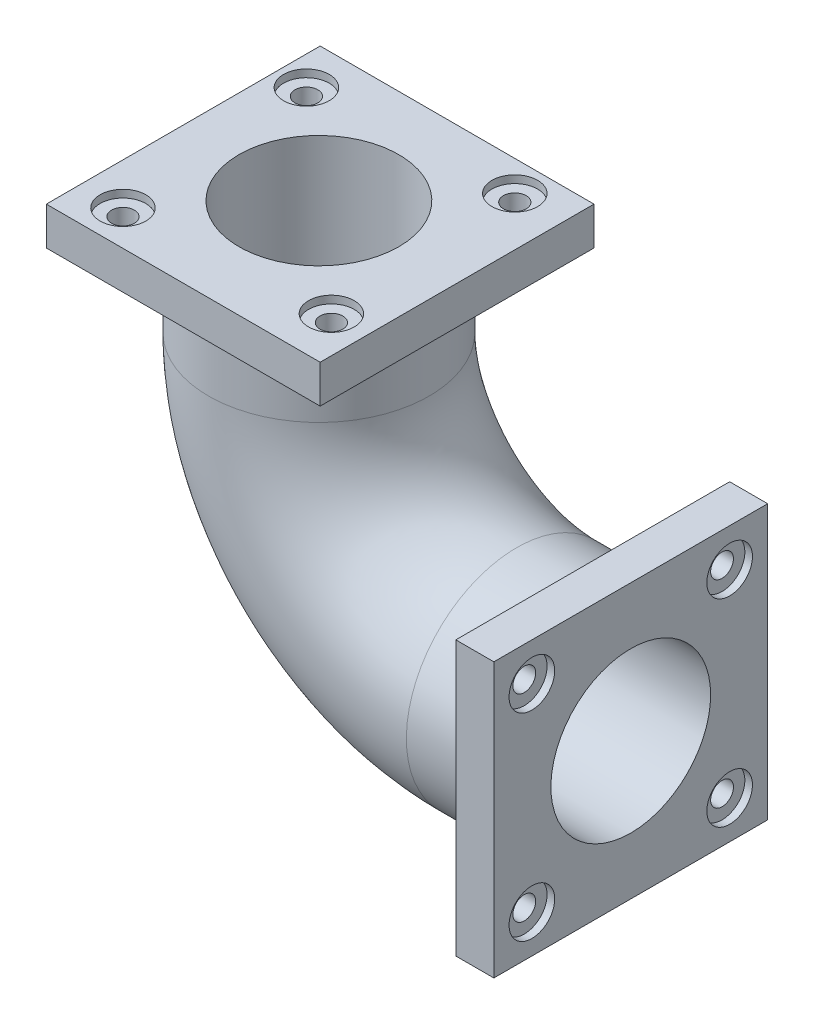
ISO-10303-21;
HEADER;
FILE_DESCRIPTION(('STEP AP214'),'2;1');
FILE_NAME('part.step','',(''),(''),'','','');
FILE_SCHEMA(('AUTOMOTIVE_DESIGN { 1 0 10303 214 1 1 1 1 }'));
ENDSEC;
DATA;
#1=APPLICATION_CONTEXT('core data for automotive mechanical design processes');
#2=APPLICATION_PROTOCOL_DEFINITION('international standard','automotive_design',2000,#1);
#3=PRODUCT_CONTEXT('',#1,'mechanical');
#4=PRODUCT('Part','Part','',(#3));
#5=PRODUCT_RELATED_PRODUCT_CATEGORY('part','',(#4));
#6=PRODUCT_DEFINITION_FORMATION('','',#4);
#7=PRODUCT_DEFINITION_CONTEXT('part definition',#1,'design');
#8=PRODUCT_DEFINITION('design','',#6,#7);
#9=PRODUCT_DEFINITION_SHAPE('','',#8);
#10=(LENGTH_UNIT() NAMED_UNIT(*) SI_UNIT(.MILLI.,.METRE.));
#11=(NAMED_UNIT(*) PLANE_ANGLE_UNIT() SI_UNIT($,.RADIAN.));
#12=(NAMED_UNIT(*) SI_UNIT($,.STERADIAN.) SOLID_ANGLE_UNIT());
#13=UNCERTAINTY_MEASURE_WITH_UNIT(LENGTH_MEASURE(1.E-05),#10,'distance_accuracy_value','');
#14=(GEOMETRIC_REPRESENTATION_CONTEXT(3) GLOBAL_UNCERTAINTY_ASSIGNED_CONTEXT((#13)) GLOBAL_UNIT_ASSIGNED_CONTEXT((#10,
#11,#12)) REPRESENTATION_CONTEXT('',''));
#15=CARTESIAN_POINT('',(0.,0.,0.));
#16=DIRECTION('',(0.,0.,1.));
#17=DIRECTION('',(1.,0.,0.));
#18=AXIS2_PLACEMENT_3D('',#15,#16,#17);
#19=CARTESIAN_POINT('',(-410.,260.,0.));
#20=DIRECTION('',(0.,1.,0.));
#21=DIRECTION('',(-1.,0.,0.));
#22=AXIS2_PLACEMENT_3D('',#19,#20,#21);
#23=CYLINDRICAL_SURFACE('',#22,145.);
#24=CARTESIAN_POINT('',(-410.,260.,0.));
#25=DIRECTION('',(0.,-1.,0.));
#26=DIRECTION('',(0.,0.,-1.));
#27=AXIS2_PLACEMENT_3D('',#24,#25,#26);
#28=CIRCLE('',#27,145.);
#29=CARTESIAN_POINT('',(-555.,260.,0.));
#30=VERTEX_POINT('',#29);
#31=EDGE_CURVE('E197',#30,#30,#28,.T.);
#32=ORIENTED_EDGE('',*,*,#31,.F.);
#33=EDGE_LOOP('',(#32));
#34=FACE_BOUND('',#33,.T.);
#35=CARTESIAN_POINT('',(-410.,360.,0.));
#36=DIRECTION('',(0.,1.,0.));
#37=DIRECTION('',(-1.,0.,0.));
#38=AXIS2_PLACEMENT_3D('',#35,#36,#37);
#39=CIRCLE('',#38,145.);
#40=CARTESIAN_POINT('',(-555.,360.,0.));
#41=VERTEX_POINT('',#40);
#42=EDGE_CURVE('E11',#41,#41,#39,.T.);
#43=ORIENTED_EDGE('',*,*,#42,.F.);
#44=EDGE_LOOP('',(#43));
#45=FACE_BOUND('',#44,.T.);
#46=ADVANCED_FACE('F35',(#34,#45),#23,.T.);
#47=CARTESIAN_POINT('',(0.,0.,0.));
#48=DIRECTION('',(-1.,0.,0.));
#49=DIRECTION('',(0.,0.,1.));
#50=AXIS2_PLACEMENT_3D('',#47,#48,#49);
#51=CYLINDRICAL_SURFACE('',#50,145.);
#52=CARTESIAN_POINT('',(-150.,0.,0.));
#53=DIRECTION('',(1.,0.,0.));
#54=DIRECTION('',(0.,0.,-1.));
#55=AXIS2_PLACEMENT_3D('',#52,#53,#54);
#56=CIRCLE('',#55,145.);
#57=CARTESIAN_POINT('',(-150.,-145.,0.));
#58=VERTEX_POINT('',#57);
#59=EDGE_CURVE('E194',#58,#58,#56,.T.);
#60=ORIENTED_EDGE('',*,*,#59,.T.);
#61=EDGE_LOOP('',(#60));
#62=FACE_BOUND('',#61,.T.);
#63=CARTESIAN_POINT('',(-50.,0.,0.));
#64=DIRECTION('',(1.,0.,0.));
#65=DIRECTION('',(0.,0.,-1.));
#66=AXIS2_PLACEMENT_3D('',#63,#64,#65);
#67=CIRCLE('',#66,145.);
#68=CARTESIAN_POINT('',(-50.,0.,-145.));
#69=VERTEX_POINT('',#68);
#70=EDGE_CURVE('E45',#69,#69,#67,.T.);
#71=ORIENTED_EDGE('',*,*,#70,.F.);
#72=EDGE_LOOP('',(#71));
#73=FACE_BOUND('',#72,.T.);
#74=ADVANCED_FACE('F307',(#62,#73),#51,.T.);
#75=CARTESIAN_POINT('',(0.,0.,0.));
#76=DIRECTION('',(1.,0.,0.));
#77=DIRECTION('',(0.,0.,-1.));
#78=AXIS2_PLACEMENT_3D('',#75,#76,#77);
#79=PLANE('',#78);
#80=CARTESIAN_POINT('',(0.,-130.,130.));
#81=DIRECTION('',(1.,0.,0.));
#82=DIRECTION('',(0.,1.,0.));
#83=AXIS2_PLACEMENT_3D('',#80,#81,#82);
#84=CIRCLE('',#83,30.);
#85=CARTESIAN_POINT('',(0.,-100.,130.));
#86=VERTEX_POINT('',#85);
#87=EDGE_CURVE('E658',#86,#86,#84,.T.);
#88=ORIENTED_EDGE('',*,*,#87,.F.);
#89=EDGE_LOOP('',(#88));
#90=FACE_BOUND('',#89,.T.);
#91=CARTESIAN_POINT('',(0.,-130.,-130.));
#92=DIRECTION('',(1.,0.,0.));
#93=DIRECTION('',(0.,0.,1.));
#94=AXIS2_PLACEMENT_3D('',#91,#92,#93);
#95=CIRCLE('',#94,30.);
#96=CARTESIAN_POINT('',(0.,-130.,-100.));
#97=VERTEX_POINT('',#96);
#98=EDGE_CURVE('E239',#97,#97,#95,.T.);
#99=ORIENTED_EDGE('',*,*,#98,.F.);
#100=EDGE_LOOP('',(#99));
#101=FACE_BOUND('',#100,.T.);
#102=CARTESIAN_POINT('',(0.,130.000000000001,-129.999999999999));
#103=DIRECTION('',(1.,0.,0.));
#104=DIRECTION('',(0.,-1.,0.));
#105=AXIS2_PLACEMENT_3D('',#102,#103,#104);
#106=CIRCLE('',#105,30.);
#107=CARTESIAN_POINT('',(0.,100.000000000001,-129.999999999999));
#108=VERTEX_POINT('',#107);
#109=EDGE_CURVE('E230',#108,#108,#106,.T.);
#110=ORIENTED_EDGE('',*,*,#109,.F.);
#111=EDGE_LOOP('',(#110));
#112=FACE_BOUND('',#111,.T.);
#113=CARTESIAN_POINT('',(0.,130.,130.));
#114=DIRECTION('',(1.,0.,0.));
#115=DIRECTION('',(0.,0.,-1.));
#116=AXIS2_PLACEMENT_3D('',#113,#114,#115);
#117=CIRCLE('',#116,30.);
#118=CARTESIAN_POINT('',(0.,130.,100.));
#119=VERTEX_POINT('',#118);
#120=EDGE_CURVE('E220',#119,#119,#117,.T.);
#121=ORIENTED_EDGE('',*,*,#120,.F.);
#122=EDGE_LOOP('',(#121));
#123=FACE_BOUND('',#122,.T.);
#124=CARTESIAN_POINT('',(0.,0.,0.));
#125=DIRECTION('',(1.,0.,0.));
#126=DIRECTION('',(0.,0.,-1.));
#127=AXIS2_PLACEMENT_3D('',#124,#125,#126);
#128=CIRCLE('',#127,105.);
#129=CARTESIAN_POINT('',(0.,0.,-105.));
#130=VERTEX_POINT('',#129);
#131=EDGE_CURVE('E177',#130,#130,#128,.T.);
#132=ORIENTED_EDGE('',*,*,#131,.F.);
#133=EDGE_LOOP('',(#132));
#134=FACE_BOUND('',#133,.T.);
#135=DIRECTION('',(0.,1.,0.));
#136=VECTOR('',#135,1.);
#137=CARTESIAN_POINT('',(0.,0.,180.));
#138=LINE('',#137,#136);
#139=CARTESIAN_POINT('',(0.,-180.,180.));
#140=VERTEX_POINT('',#139);
#141=CARTESIAN_POINT('',(0.,180.,180.));
#142=VERTEX_POINT('',#141);
#143=EDGE_CURVE('E157',#140,#142,#138,.T.);
#144=ORIENTED_EDGE('',*,*,#143,.F.);
#145=DIRECTION('',(0.,0.,1.));
#146=VECTOR('',#145,1.);
#147=CARTESIAN_POINT('',(0.,-180.,0.));
#148=LINE('',#147,#146);
#149=CARTESIAN_POINT('',(0.,-180.,-180.));
#150=VERTEX_POINT('',#149);
#151=EDGE_CURVE('E170',#150,#140,#148,.T.);
#152=ORIENTED_EDGE('',*,*,#151,.F.);
#153=DIRECTION('',(0.,1.,0.));
#154=VECTOR('',#153,1.);
#155=CARTESIAN_POINT('',(0.,0.,-180.));
#156=LINE('',#155,#154);
#157=CARTESIAN_POINT('',(0.,180.,-180.));
#158=VERTEX_POINT('',#157);
#159=EDGE_CURVE('E172',#150,#158,#156,.T.);
#160=ORIENTED_EDGE('',*,*,#159,.T.);
#161=DIRECTION('',(0.,0.,1.));
#162=VECTOR('',#161,1.);
#163=CARTESIAN_POINT('',(0.,180.,0.));
#164=LINE('',#163,#162);
#165=EDGE_CURVE('E162',#158,#142,#164,.T.);
#166=ORIENTED_EDGE('',*,*,#165,.T.);
#167=EDGE_LOOP('',(#144,#152,#160,#166));
#168=FACE_BOUND('',#167,.T.);
#169=ADVANCED_FACE('F37',(#90,#101,#112,#123,#134,#168),#79,.T.);
#170=CARTESIAN_POINT('',(-410.,410.,0.));
#171=DIRECTION('',(0.,-1.,0.));
#172=DIRECTION('',(0.,0.,-1.));
#173=AXIS2_PLACEMENT_3D('',#170,#171,#172);
#174=PLANE('',#173);
#175=CARTESIAN_POINT('',(-530.556062022507,410.,137.001424260199));
#176=DIRECTION('',(0.,1.,0.));
#177=DIRECTION('',(0.,0.,1.));
#178=AXIS2_PLACEMENT_3D('',#175,#176,#177);
#179=CIRCLE('',#178,30.);
#180=CARTESIAN_POINT('',(-530.556062022507,410.,167.0014242602));
#181=VERTEX_POINT('',#180);
#182=EDGE_CURVE('E262',#181,#181,#179,.T.);
#183=ORIENTED_EDGE('',*,*,#182,.F.);
#184=EDGE_LOOP('',(#183));
#185=FACE_BOUND('',#184,.T.);
#186=CARTESIAN_POINT('',(-272.998575739801,410.,120.556062022508));
#187=DIRECTION('',(0.,1.,0.));
#188=DIRECTION('',(1.,0.,0.));
#189=AXIS2_PLACEMENT_3D('',#186,#187,#188);
#190=CIRCLE('',#189,30.);
#191=CARTESIAN_POINT('',(-242.998575739801,410.,120.556062022508));
#192=VERTEX_POINT('',#191);
#193=EDGE_CURVE('E268',#192,#192,#190,.T.);
#194=ORIENTED_EDGE('',*,*,#193,.F.);
#195=EDGE_LOOP('',(#194));
#196=FACE_BOUND('',#195,.T.);
#197=CARTESIAN_POINT('',(-289.443937977494,410.,-137.0014242602));
#198=DIRECTION('',(0.,1.,0.));
#199=DIRECTION('',(0.,0.,-1.));
#200=AXIS2_PLACEMENT_3D('',#197,#198,#199);
#201=CIRCLE('',#200,30.);
#202=CARTESIAN_POINT('',(-289.443937977494,410.,-167.0014242602));
#203=VERTEX_POINT('',#202);
#204=EDGE_CURVE('E216',#203,#203,#201,.T.);
#205=ORIENTED_EDGE('',*,*,#204,.F.);
#206=EDGE_LOOP('',(#205));
#207=FACE_BOUND('',#206,.T.);
#208=CARTESIAN_POINT('',(-547.001424260199,410.,-120.556062022508));
#209=DIRECTION('',(0.,1.,0.));
#210=DIRECTION('',(-1.,0.,0.));
#211=AXIS2_PLACEMENT_3D('',#208,#209,#210);
#212=CIRCLE('',#211,30.);
#213=CARTESIAN_POINT('',(-577.001424260199,410.,-120.556062022508));
#214=VERTEX_POINT('',#213);
#215=EDGE_CURVE('E145',#214,#214,#212,.T.);
#216=ORIENTED_EDGE('',*,*,#215,.F.);
#217=EDGE_LOOP('',(#216));
#218=FACE_BOUND('',#217,.T.);
#219=CARTESIAN_POINT('',(-410.,410.,0.));
#220=DIRECTION('',(0.,-1.,0.));
#221=DIRECTION('',(1.,0.,0.));
#222=AXIS2_PLACEMENT_3D('',#219,#220,#221);
#223=CIRCLE('',#222,105.);
#224=CARTESIAN_POINT('',(-305.,410.,0.));
#225=VERTEX_POINT('',#224);
#226=EDGE_CURVE('E189',#225,#225,#223,.T.);
#227=ORIENTED_EDGE('',*,*,#226,.T.);
#228=EDGE_LOOP('',(#227));
#229=FACE_BOUND('',#228,.T.);
#230=DIRECTION('',(0.,0.,-1.));
#231=VECTOR('',#230,1.);
#232=CARTESIAN_POINT('',(-585.270541640075,410.,0.));
#233=LINE('',#232,#231);
#234=CARTESIAN_POINT('',(-585.270541640075,410.,183.074605452746));
#235=VERTEX_POINT('',#234);
#236=CARTESIAN_POINT('',(-585.270541640075,410.,-176.925394547254));
#237=VERTEX_POINT('',#236);
#238=EDGE_CURVE('E150',#235,#237,#233,.T.);
#239=ORIENTED_EDGE('',*,*,#238,.F.);
#240=DIRECTION('',(-1.,0.,0.));
#241=VECTOR('',#240,1.);
#242=CARTESIAN_POINT('',(2.00589118759293E-13,410.,183.074605452746));
#243=LINE('',#242,#241);
#244=CARTESIAN_POINT('',(-225.270541640075,410.,183.074605452746));
#245=VERTEX_POINT('',#244);
#246=EDGE_CURVE('E129',#245,#235,#243,.T.);
#247=ORIENTED_EDGE('',*,*,#246,.F.);
#248=DIRECTION('',(0.,0.,-1.));
#249=VECTOR('',#248,1.);
#250=CARTESIAN_POINT('',(-225.270541640075,410.,0.));
#251=LINE('',#250,#249);
#252=CARTESIAN_POINT('',(-225.270541640075,410.,-176.925394547254));
#253=VERTEX_POINT('',#252);
#254=EDGE_CURVE('E142',#245,#253,#251,.T.);
#255=ORIENTED_EDGE('',*,*,#254,.T.);
#256=DIRECTION('',(-1.,0.,0.));
#257=VECTOR('',#256,1.);
#258=CARTESIAN_POINT('',(1.45077967528035E-13,410.,-176.925394547254));
#259=LINE('',#258,#257);
#260=EDGE_CURVE('E139',#253,#237,#259,.T.);
#261=ORIENTED_EDGE('',*,*,#260,.T.);
#262=EDGE_LOOP('',(#239,#247,#255,#261));
#263=FACE_BOUND('',#262,.T.);
#264=ADVANCED_FACE('F285',(#185,#196,#207,#218,#229,#263),#174,.F.);
#265=CARTESIAN_POINT('',(-150.,260.,0.));
#266=DIRECTION('',(0.,0.,-1.));
#267=DIRECTION('',(-1.,0.,0.));
#268=AXIS2_PLACEMENT_3D('',#265,#266,#267);
#269=TOROIDAL_SURFACE('',#268,260.,145.);
#270=CARTESIAN_POINT('',(-150.,260.,0.));
#271=DIRECTION('',(0.,0.,-1.));
#272=DIRECTION('',(-1.,0.,0.));
#273=AXIS2_PLACEMENT_3D('',#270,#271,#272);
#274=CIRCLE('',#273,405.);
#275=EDGE_CURVE('',#58,#30,#274,.T.);
#276=ORIENTED_EDGE('',*,*,#59,.F.);
#277=ORIENTED_EDGE('',*,*,#31,.T.);
#278=ORIENTED_EDGE('',*,*,#275,.T.);
#279=ORIENTED_EDGE('',*,*,#275,.F.);
#280=EDGE_LOOP('',(#276,#278,#277,#279));
#281=FACE_BOUND('',#280,.T.);
#282=ADVANCED_FACE('F288',(#281),#269,.T.);
#283=CARTESIAN_POINT('',(0.,0.,0.));
#284=DIRECTION('',(-1.,0.,0.));
#285=DIRECTION('',(0.,0.,1.));
#286=AXIS2_PLACEMENT_3D('',#283,#284,#285);
#287=CYLINDRICAL_SURFACE('',#286,105.);
#288=CARTESIAN_POINT('',(-150.,0.,0.));
#289=DIRECTION('',(-1.,0.,0.));
#290=DIRECTION('',(0.,0.,1.));
#291=AXIS2_PLACEMENT_3D('',#288,#289,#290);
#292=CIRCLE('',#291,105.);
#293=CARTESIAN_POINT('',(-150.,-105.,0.));
#294=VERTEX_POINT('',#293);
#295=EDGE_CURVE('E183',#294,#294,#292,.F.);
#296=ORIENTED_EDGE('',*,*,#295,.F.);
#297=EDGE_LOOP('',(#296));
#298=FACE_BOUND('',#297,.T.);
#299=ORIENTED_EDGE('',*,*,#131,.T.);
#300=EDGE_LOOP('',(#299));
#301=FACE_BOUND('',#300,.T.);
#302=ADVANCED_FACE('F319',(#298,#301),#287,.F.);
#303=CARTESIAN_POINT('',(-150.,260.,0.));
#304=DIRECTION('',(0.,0.,-1.));
#305=DIRECTION('',(-1.,0.,0.));
#306=AXIS2_PLACEMENT_3D('',#303,#304,#305);
#307=TOROIDAL_SURFACE('',#306,260.,105.);
#308=CARTESIAN_POINT('',(-410.,260.,0.));
#309=DIRECTION('',(0.,-1.,0.));
#310=DIRECTION('',(0.,0.,-1.));
#311=AXIS2_PLACEMENT_3D('',#308,#309,#310);
#312=CIRCLE('',#311,105.);
#313=CARTESIAN_POINT('',(-515.,260.,0.));
#314=VERTEX_POINT('',#313);
#315=EDGE_CURVE('E186',#314,#314,#312,.T.);
#316=CARTESIAN_POINT('',(-150.,260.,0.));
#317=DIRECTION('',(0.,0.,-1.));
#318=DIRECTION('',(-1.,0.,0.));
#319=AXIS2_PLACEMENT_3D('',#316,#317,#318);
#320=CIRCLE('',#319,365.);
#321=EDGE_CURVE('',#294,#314,#320,.T.);
#322=ORIENTED_EDGE('',*,*,#295,.T.);
#323=ORIENTED_EDGE('',*,*,#315,.F.);
#324=ORIENTED_EDGE('',*,*,#321,.T.);
#325=ORIENTED_EDGE('',*,*,#321,.F.);
#326=EDGE_LOOP('',(#322,#324,#323,#325));
#327=FACE_BOUND('',#326,.T.);
#328=ADVANCED_FACE('F326',(#327),#307,.F.);
#329=CARTESIAN_POINT('',(-410.,260.,0.));
#330=DIRECTION('',(0.,1.,0.));
#331=DIRECTION('',(-1.,0.,0.));
#332=AXIS2_PLACEMENT_3D('',#329,#330,#331);
#333=CYLINDRICAL_SURFACE('',#332,105.);
#334=ORIENTED_EDGE('',*,*,#226,.F.);
#335=EDGE_LOOP('',(#334));
#336=FACE_BOUND('',#335,.T.);
#337=ORIENTED_EDGE('',*,*,#315,.T.);
#338=EDGE_LOOP('',(#337));
#339=FACE_BOUND('',#338,.T.);
#340=ADVANCED_FACE('F322',(#336,#339),#333,.F.);
#341=CARTESIAN_POINT('',(-50.,0.,180.));
#342=DIRECTION('',(0.,0.,-1.));
#343=DIRECTION('',(-1.,0.,0.));
#344=AXIS2_PLACEMENT_3D('',#341,#342,#343);
#345=PLANE('',#344);
#346=ORIENTED_EDGE('',*,*,#143,.T.);
#347=DIRECTION('',(1.,0.,0.));
#348=VECTOR('',#347,1.);
#349=CARTESIAN_POINT('',(-50.,180.,180.));
#350=LINE('',#349,#348);
#351=CARTESIAN_POINT('',(-50.,180.,180.));
#352=VERTEX_POINT('',#351);
#353=EDGE_CURVE('E79',#352,#142,#350,.T.);
#354=ORIENTED_EDGE('',*,*,#353,.F.);
#355=DIRECTION('',(0.,1.,0.));
#356=VECTOR('',#355,1.);
#357=CARTESIAN_POINT('',(-50.,0.,180.));
#358=LINE('',#357,#356);
#359=CARTESIAN_POINT('',(-50.,-180.,180.));
#360=VERTEX_POINT('',#359);
#361=EDGE_CURVE('E54',#360,#352,#358,.T.);
#362=ORIENTED_EDGE('',*,*,#361,.F.);
#363=DIRECTION('',(1.,0.,0.));
#364=VECTOR('',#363,1.);
#365=CARTESIAN_POINT('',(-50.,-180.,180.));
#366=LINE('',#365,#364);
#367=EDGE_CURVE('E168',#360,#140,#366,.T.);
#368=ORIENTED_EDGE('',*,*,#367,.T.);
#369=EDGE_LOOP('',(#346,#354,#362,#368));
#370=FACE_BOUND('',#369,.T.);
#371=ADVANCED_FACE('F325',(#370),#345,.F.);
#372=CARTESIAN_POINT('',(-50.,180.,0.));
#373=DIRECTION('',(0.,1.,0.));
#374=DIRECTION('',(0.,0.,1.));
#375=AXIS2_PLACEMENT_3D('',#372,#373,#374);
#376=PLANE('',#375);
#377=ORIENTED_EDGE('',*,*,#165,.F.);
#378=DIRECTION('',(1.,0.,0.));
#379=VECTOR('',#378,1.);
#380=CARTESIAN_POINT('',(-50.,180.,-180.));
#381=LINE('',#380,#379);
#382=CARTESIAN_POINT('',(-50.,180.,-180.));
#383=VERTEX_POINT('',#382);
#384=EDGE_CURVE('E72',#383,#158,#381,.T.);
#385=ORIENTED_EDGE('',*,*,#384,.F.);
#386=DIRECTION('',(0.,0.,1.));
#387=VECTOR('',#386,1.);
#388=CARTESIAN_POINT('',(-50.,180.,0.));
#389=LINE('',#388,#387);
#390=EDGE_CURVE('E166',#383,#352,#389,.T.);
#391=ORIENTED_EDGE('',*,*,#390,.T.);
#392=ORIENTED_EDGE('',*,*,#353,.T.);
#393=EDGE_LOOP('',(#377,#385,#391,#392));
#394=FACE_BOUND('',#393,.T.);
#395=ADVANCED_FACE('F336',(#394),#376,.T.);
#396=CARTESIAN_POINT('',(-50.,0.,-180.));
#397=DIRECTION('',(0.,0.,-1.));
#398=DIRECTION('',(-1.,0.,0.));
#399=AXIS2_PLACEMENT_3D('',#396,#397,#398);
#400=PLANE('',#399);
#401=ORIENTED_EDGE('',*,*,#159,.F.);
#402=DIRECTION('',(1.,0.,0.));
#403=VECTOR('',#402,1.);
#404=CARTESIAN_POINT('',(-50.,-180.,-180.));
#405=LINE('',#404,#403);
#406=CARTESIAN_POINT('',(-50.,-180.,-180.));
#407=VERTEX_POINT('',#406);
#408=EDGE_CURVE('E179',#407,#150,#405,.T.);
#409=ORIENTED_EDGE('',*,*,#408,.F.);
#410=DIRECTION('',(0.,1.,0.));
#411=VECTOR('',#410,1.);
#412=CARTESIAN_POINT('',(-50.,0.,-180.));
#413=LINE('',#412,#411);
#414=EDGE_CURVE('E164',#407,#383,#413,.T.);
#415=ORIENTED_EDGE('',*,*,#414,.T.);
#416=ORIENTED_EDGE('',*,*,#384,.T.);
#417=EDGE_LOOP('',(#401,#409,#415,#416));
#418=FACE_BOUND('',#417,.T.);
#419=ADVANCED_FACE('F342',(#418),#400,.T.);
#420=CARTESIAN_POINT('',(-50.,-180.,0.));
#421=DIRECTION('',(0.,1.,0.));
#422=DIRECTION('',(0.,0.,1.));
#423=AXIS2_PLACEMENT_3D('',#420,#421,#422);
#424=PLANE('',#423);
#425=ORIENTED_EDGE('',*,*,#151,.T.);
#426=ORIENTED_EDGE('',*,*,#367,.F.);
#427=DIRECTION('',(0.,0.,1.));
#428=VECTOR('',#427,1.);
#429=CARTESIAN_POINT('',(-50.,-180.,0.));
#430=LINE('',#429,#428);
#431=EDGE_CURVE('E84',#407,#360,#430,.T.);
#432=ORIENTED_EDGE('',*,*,#431,.F.);
#433=ORIENTED_EDGE('',*,*,#408,.T.);
#434=EDGE_LOOP('',(#425,#426,#432,#433));
#435=FACE_BOUND('',#434,.T.);
#436=ADVANCED_FACE('F338',(#435),#424,.F.);
#437=CARTESIAN_POINT('',(-50.,0.,0.));
#438=DIRECTION('',(1.,0.,0.));
#439=DIRECTION('',(0.,0.,-1.));
#440=AXIS2_PLACEMENT_3D('',#437,#438,#439);
#441=PLANE('',#440);
#442=CARTESIAN_POINT('',(-50.,-130.,130.));
#443=DIRECTION('',(1.,0.,0.));
#444=DIRECTION('',(0.,0.,-1.));
#445=AXIS2_PLACEMENT_3D('',#442,#443,#444);
#446=CIRCLE('',#445,15.);
#447=CARTESIAN_POINT('',(-50.,-130.,115.));
#448=VERTEX_POINT('',#447);
#449=EDGE_CURVE('E39',#448,#448,#446,.T.);
#450=ORIENTED_EDGE('',*,*,#449,.T.);
#451=EDGE_LOOP('',(#450));
#452=FACE_BOUND('',#451,.T.);
#453=CARTESIAN_POINT('',(-50.,-130.,-130.));
#454=DIRECTION('',(1.,0.,0.));
#455=DIRECTION('',(0.,0.,-1.));
#456=AXIS2_PLACEMENT_3D('',#453,#454,#455);
#457=CIRCLE('',#456,15.);
#458=CARTESIAN_POINT('',(-50.,-130.,-145.));
#459=VERTEX_POINT('',#458);
#460=EDGE_CURVE('E224',#459,#459,#457,.T.);
#461=ORIENTED_EDGE('',*,*,#460,.T.);
#462=EDGE_LOOP('',(#461));
#463=FACE_BOUND('',#462,.T.);
#464=CARTESIAN_POINT('',(-50.,130.000000000001,-129.999999999999));
#465=DIRECTION('',(1.,0.,0.));
#466=DIRECTION('',(0.,0.,-1.));
#467=AXIS2_PLACEMENT_3D('',#464,#465,#466);
#468=CIRCLE('',#467,15.);
#469=CARTESIAN_POINT('',(-50.,130.000000000001,-144.999999999999));
#470=VERTEX_POINT('',#469);
#471=EDGE_CURVE('E222',#470,#470,#468,.T.);
#472=ORIENTED_EDGE('',*,*,#471,.T.);
#473=EDGE_LOOP('',(#472));
#474=FACE_BOUND('',#473,.T.);
#475=CARTESIAN_POINT('',(-50.,130.,130.));
#476=DIRECTION('',(1.,0.,0.));
#477=DIRECTION('',(0.,0.,-1.));
#478=AXIS2_PLACEMENT_3D('',#475,#476,#477);
#479=CIRCLE('',#478,15.);
#480=CARTESIAN_POINT('',(-50.,130.,115.));
#481=VERTEX_POINT('',#480);
#482=EDGE_CURVE('E217',#481,#481,#479,.T.);
#483=ORIENTED_EDGE('',*,*,#482,.T.);
#484=EDGE_LOOP('',(#483));
#485=FACE_BOUND('',#484,.T.);
#486=ORIENTED_EDGE('',*,*,#361,.T.);
#487=ORIENTED_EDGE('',*,*,#390,.F.);
#488=ORIENTED_EDGE('',*,*,#414,.F.);
#489=ORIENTED_EDGE('',*,*,#431,.T.);
#490=EDGE_LOOP('',(#486,#487,#488,#489));
#491=FACE_BOUND('',#490,.T.);
#492=ORIENTED_EDGE('',*,*,#70,.T.);
#493=EDGE_LOOP('',(#492));
#494=FACE_BOUND('',#493,.T.);
#495=ADVANCED_FACE('F341',(#452,#463,#474,#485,#491,#494),#441,.F.);
#496=CARTESIAN_POINT('',(-585.270541640075,360.,0.));
#497=DIRECTION('',(1.,0.,0.));
#498=DIRECTION('',(0.,1.,0.));
#499=AXIS2_PLACEMENT_3D('',#496,#497,#498);
#500=PLANE('',#499);
#501=ORIENTED_EDGE('',*,*,#238,.T.);
#502=DIRECTION('',(0.,1.,0.));
#503=VECTOR('',#502,1.);
#504=CARTESIAN_POINT('',(-585.270541640075,360.,-176.925394547254));
#505=LINE('',#504,#503);
#506=CARTESIAN_POINT('',(-585.270541640075,360.,-176.925394547254));
#507=VERTEX_POINT('',#506);
#508=EDGE_CURVE('E137',#507,#237,#505,.T.);
#509=ORIENTED_EDGE('',*,*,#508,.F.);
#510=DIRECTION('',(0.,0.,-1.));
#511=VECTOR('',#510,1.);
#512=CARTESIAN_POINT('',(-585.270541640075,360.,0.));
#513=LINE('',#512,#511);
#514=CARTESIAN_POINT('',(-585.270541640075,360.,183.074605452746));
#515=VERTEX_POINT('',#514);
#516=EDGE_CURVE('E119',#515,#507,#513,.T.);
#517=ORIENTED_EDGE('',*,*,#516,.F.);
#518=DIRECTION('',(0.,1.,0.));
#519=VECTOR('',#518,1.);
#520=CARTESIAN_POINT('',(-585.270541640075,360.,183.074605452746));
#521=LINE('',#520,#519);
#522=EDGE_CURVE('E126',#515,#235,#521,.T.);
#523=ORIENTED_EDGE('',*,*,#522,.T.);
#524=EDGE_LOOP('',(#501,#509,#517,#523));
#525=FACE_BOUND('',#524,.T.);
#526=ADVANCED_FACE('F136',(#525),#500,.F.);
#527=CARTESIAN_POINT('',(1.26574250450949E-13,360.,-176.925394547254));
#528=DIRECTION('',(0.,0.,-1.));
#529=DIRECTION('',(-1.,0.,0.));
#530=AXIS2_PLACEMENT_3D('',#527,#528,#529);
#531=PLANE('',#530);
#532=ORIENTED_EDGE('',*,*,#260,.F.);
#533=DIRECTION('',(0.,1.,0.));
#534=VECTOR('',#533,1.);
#535=CARTESIAN_POINT('',(-225.270541640075,360.,-176.925394547254));
#536=LINE('',#535,#534);
#537=CARTESIAN_POINT('',(-225.270541640075,360.,-176.925394547254));
#538=VERTEX_POINT('',#537);
#539=EDGE_CURVE('E158',#538,#253,#536,.T.);
#540=ORIENTED_EDGE('',*,*,#539,.F.);
#541=DIRECTION('',(-1.,0.,0.));
#542=VECTOR('',#541,1.);
#543=CARTESIAN_POINT('',(1.26574250450949E-13,360.,-176.925394547254));
#544=LINE('',#543,#542);
#545=EDGE_CURVE('E134',#538,#507,#544,.T.);
#546=ORIENTED_EDGE('',*,*,#545,.T.);
#547=ORIENTED_EDGE('',*,*,#508,.T.);
#548=EDGE_LOOP('',(#532,#540,#546,#547));
#549=FACE_BOUND('',#548,.T.);
#550=ADVANCED_FACE('F295',(#549),#531,.T.);
#551=CARTESIAN_POINT('',(-225.270541640075,360.,0.));
#552=DIRECTION('',(1.,0.,0.));
#553=DIRECTION('',(0.,1.,0.));
#554=AXIS2_PLACEMENT_3D('',#551,#552,#553);
#555=PLANE('',#554);
#556=ORIENTED_EDGE('',*,*,#254,.F.);
#557=DIRECTION('',(0.,1.,0.));
#558=VECTOR('',#557,1.);
#559=CARTESIAN_POINT('',(-225.270541640075,360.,183.074605452746));
#560=LINE('',#559,#558);
#561=CARTESIAN_POINT('',(-225.270541640075,360.,183.074605452746));
#562=VERTEX_POINT('',#561);
#563=EDGE_CURVE('E133',#562,#245,#560,.T.);
#564=ORIENTED_EDGE('',*,*,#563,.F.);
#565=DIRECTION('',(0.,0.,-1.));
#566=VECTOR('',#565,1.);
#567=CARTESIAN_POINT('',(-225.270541640075,360.,0.));
#568=LINE('',#567,#566);
#569=EDGE_CURVE('E122',#562,#538,#568,.T.);
#570=ORIENTED_EDGE('',*,*,#569,.T.);
#571=ORIENTED_EDGE('',*,*,#539,.T.);
#572=EDGE_LOOP('',(#556,#564,#570,#571));
#573=FACE_BOUND('',#572,.T.);
#574=ADVANCED_FACE('F297',(#573),#555,.T.);
#575=CARTESIAN_POINT('',(1.82085401682207E-13,360.,183.074605452746));
#576=DIRECTION('',(0.,0.,-1.));
#577=DIRECTION('',(-1.,0.,0.));
#578=AXIS2_PLACEMENT_3D('',#575,#576,#577);
#579=PLANE('',#578);
#580=ORIENTED_EDGE('',*,*,#246,.T.);
#581=ORIENTED_EDGE('',*,*,#522,.F.);
#582=DIRECTION('',(-1.,0.,0.));
#583=VECTOR('',#582,1.);
#584=CARTESIAN_POINT('',(1.82085401682207E-13,360.,183.074605452746));
#585=LINE('',#584,#583);
#586=EDGE_CURVE('E113',#562,#515,#585,.T.);
#587=ORIENTED_EDGE('',*,*,#586,.F.);
#588=ORIENTED_EDGE('',*,*,#563,.T.);
#589=EDGE_LOOP('',(#580,#581,#587,#588));
#590=FACE_BOUND('',#589,.T.);
#591=ADVANCED_FACE('F127',(#590),#579,.F.);
#592=CARTESIAN_POINT('',(1.53855729154734E-13,360.,0.));
#593=DIRECTION('',(0.,1.,0.));
#594=DIRECTION('',(-1.,0.,0.));
#595=AXIS2_PLACEMENT_3D('',#592,#593,#594);
#596=PLANE('',#595);
#597=CARTESIAN_POINT('',(-530.556062022507,360.,137.001424260199));
#598=DIRECTION('',(0.,1.,0.));
#599=DIRECTION('',(-1.,0.,0.));
#600=AXIS2_PLACEMENT_3D('',#597,#598,#599);
#601=CIRCLE('',#600,15.);
#602=CARTESIAN_POINT('',(-545.556062022507,360.,137.001424260199));
#603=VERTEX_POINT('',#602);
#604=EDGE_CURVE('E213',#603,#603,#601,.T.);
#605=ORIENTED_EDGE('',*,*,#604,.T.);
#606=EDGE_LOOP('',(#605));
#607=FACE_BOUND('',#606,.T.);
#608=CARTESIAN_POINT('',(-272.998575739801,360.,120.556062022508));
#609=DIRECTION('',(0.,1.,0.));
#610=DIRECTION('',(-1.,0.,0.));
#611=AXIS2_PLACEMENT_3D('',#608,#609,#610);
#612=CIRCLE('',#611,15.);
#613=CARTESIAN_POINT('',(-287.998575739801,360.,120.556062022508));
#614=VERTEX_POINT('',#613);
#615=EDGE_CURVE('E209',#614,#614,#612,.T.);
#616=ORIENTED_EDGE('',*,*,#615,.T.);
#617=EDGE_LOOP('',(#616));
#618=FACE_BOUND('',#617,.T.);
#619=CARTESIAN_POINT('',(-289.443937977494,360.,-137.0014242602));
#620=DIRECTION('',(0.,1.,0.));
#621=DIRECTION('',(-1.,0.,0.));
#622=AXIS2_PLACEMENT_3D('',#619,#620,#621);
#623=CIRCLE('',#622,15.);
#624=CARTESIAN_POINT('',(-304.443937977494,360.,-137.0014242602));
#625=VERTEX_POINT('',#624);
#626=EDGE_CURVE('E206',#625,#625,#623,.T.);
#627=ORIENTED_EDGE('',*,*,#626,.T.);
#628=EDGE_LOOP('',(#627));
#629=FACE_BOUND('',#628,.T.);
#630=CARTESIAN_POINT('',(-547.001424260199,360.,-120.556062022508));
#631=DIRECTION('',(0.,1.,0.));
#632=DIRECTION('',(-1.,0.,0.));
#633=AXIS2_PLACEMENT_3D('',#630,#631,#632);
#634=CIRCLE('',#633,15.);
#635=CARTESIAN_POINT('',(-562.001424260199,360.,-120.556062022508));
#636=VERTEX_POINT('',#635);
#637=EDGE_CURVE('E202',#636,#636,#634,.T.);
#638=ORIENTED_EDGE('',*,*,#637,.T.);
#639=EDGE_LOOP('',(#638));
#640=FACE_BOUND('',#639,.T.);
#641=ORIENTED_EDGE('',*,*,#516,.T.);
#642=ORIENTED_EDGE('',*,*,#545,.F.);
#643=ORIENTED_EDGE('',*,*,#569,.F.);
#644=ORIENTED_EDGE('',*,*,#586,.T.);
#645=EDGE_LOOP('',(#641,#642,#643,#644));
#646=FACE_BOUND('',#645,.T.);
#647=ORIENTED_EDGE('',*,*,#42,.T.);
#648=EDGE_LOOP('',(#647));
#649=FACE_BOUND('',#648,.T.);
#650=ADVANCED_FACE('F115',(#607,#618,#629,#640,#646,#649),#596,.F.);
#651=CARTESIAN_POINT('',(-547.001424260199,400.,-120.556062022508));
#652=DIRECTION('',(0.,1.,0.));
#653=DIRECTION('',(-1.,0.,0.));
#654=AXIS2_PLACEMENT_3D('',#651,#652,#653);
#655=CYLINDRICAL_SURFACE('',#654,30.);
#656=CARTESIAN_POINT('',(-547.001424260199,400.,-120.556062022508));
#657=DIRECTION('',(0.,1.,0.));
#658=DIRECTION('',(-1.,0.,0.));
#659=AXIS2_PLACEMENT_3D('',#656,#657,#658);
#660=CIRCLE('',#659,30.);
#661=CARTESIAN_POINT('',(-577.001424260199,400.,-120.556062022508));
#662=VERTEX_POINT('',#661);
#663=EDGE_CURVE('E152',#662,#662,#660,.T.);
#664=ORIENTED_EDGE('',*,*,#663,.F.);
#665=EDGE_LOOP('',(#664));
#666=FACE_BOUND('',#665,.T.);
#667=ORIENTED_EDGE('',*,*,#215,.T.);
#668=EDGE_LOOP('',(#667));
#669=FACE_BOUND('',#668,.T.);
#670=ADVANCED_FACE('F283',(#666,#669),#655,.F.);
#671=CARTESIAN_POINT('',(-547.001424260199,400.,-120.556062022508));
#672=DIRECTION('',(0.,1.,0.));
#673=DIRECTION('',(-1.,0.,0.));
#674=AXIS2_PLACEMENT_3D('',#671,#672,#673);
#675=PLANE('',#674);
#676=CARTESIAN_POINT('',(-547.001424260199,400.,-120.556062022508));
#677=DIRECTION('',(0.,1.,0.));
#678=DIRECTION('',(-1.,0.,0.));
#679=AXIS2_PLACEMENT_3D('',#676,#677,#678);
#680=CIRCLE('',#679,15.);
#681=CARTESIAN_POINT('',(-562.001424260199,400.,-120.556062022508));
#682=VERTEX_POINT('',#681);
#683=EDGE_CURVE('E205',#682,#682,#680,.T.);
#684=ORIENTED_EDGE('',*,*,#683,.F.);
#685=EDGE_LOOP('',(#684));
#686=FACE_BOUND('',#685,.T.);
#687=ORIENTED_EDGE('',*,*,#663,.T.);
#688=EDGE_LOOP('',(#687));
#689=FACE_BOUND('',#688,.T.);
#690=ADVANCED_FACE('F380',(#686,#689),#675,.T.);
#691=CARTESIAN_POINT('',(-547.001424260199,352.,-120.556062022508));
#692=DIRECTION('',(0.,1.,0.));
#693=DIRECTION('',(-1.,0.,0.));
#694=AXIS2_PLACEMENT_3D('',#691,#692,#693);
#695=CYLINDRICAL_SURFACE('',#694,15.);
#696=ORIENTED_EDGE('',*,*,#683,.T.);
#697=EDGE_LOOP('',(#696));
#698=FACE_BOUND('',#697,.T.);
#699=ORIENTED_EDGE('',*,*,#637,.F.);
#700=EDGE_LOOP('',(#699));
#701=FACE_BOUND('',#700,.T.);
#702=ADVANCED_FACE('F390',(#698,#701),#695,.F.);
#703=CARTESIAN_POINT('',(-289.443937977494,400.,-137.0014242602));
#704=DIRECTION('',(0.,1.,0.));
#705=DIRECTION('',(-1.,0.,0.));
#706=AXIS2_PLACEMENT_3D('',#703,#704,#705);
#707=CYLINDRICAL_SURFACE('',#706,30.);
#708=CARTESIAN_POINT('',(-289.443937977494,400.,-137.0014242602));
#709=DIRECTION('',(0.,1.,0.));
#710=DIRECTION('',(0.,0.,-1.));
#711=AXIS2_PLACEMENT_3D('',#708,#709,#710);
#712=CIRCLE('',#711,30.);
#713=CARTESIAN_POINT('',(-289.443937977494,400.,-167.0014242602));
#714=VERTEX_POINT('',#713);
#715=EDGE_CURVE('E271',#714,#714,#712,.T.);
#716=ORIENTED_EDGE('',*,*,#715,.F.);
#717=EDGE_LOOP('',(#716));
#718=FACE_BOUND('',#717,.T.);
#719=ORIENTED_EDGE('',*,*,#204,.T.);
#720=EDGE_LOOP('',(#719));
#721=FACE_BOUND('',#720,.T.);
#722=ADVANCED_FACE('F400',(#718,#721),#707,.F.);
#723=CARTESIAN_POINT('',(-289.443937977494,400.,-137.0014242602));
#724=DIRECTION('',(0.,1.,0.));
#725=DIRECTION('',(0.,0.,-1.));
#726=AXIS2_PLACEMENT_3D('',#723,#724,#725);
#727=PLANE('',#726);
#728=CARTESIAN_POINT('',(-289.443937977494,400.,-137.0014242602));
#729=DIRECTION('',(0.,1.,0.));
#730=DIRECTION('',(0.,0.,-1.));
#731=AXIS2_PLACEMENT_3D('',#728,#729,#730);
#732=CIRCLE('',#731,15.);
#733=CARTESIAN_POINT('',(-289.443937977494,400.,-152.0014242602));
#734=VERTEX_POINT('',#733);
#735=EDGE_CURVE('E249',#734,#734,#732,.T.);
#736=ORIENTED_EDGE('',*,*,#735,.F.);
#737=EDGE_LOOP('',(#736));
#738=FACE_BOUND('',#737,.T.);
#739=ORIENTED_EDGE('',*,*,#715,.T.);
#740=EDGE_LOOP('',(#739));
#741=FACE_BOUND('',#740,.T.);
#742=ADVANCED_FACE('F426',(#738,#741),#727,.T.);
#743=CARTESIAN_POINT('',(-272.998575739801,400.,120.556062022508));
#744=DIRECTION('',(0.,1.,0.));
#745=DIRECTION('',(-1.,0.,0.));
#746=AXIS2_PLACEMENT_3D('',#743,#744,#745);
#747=CYLINDRICAL_SURFACE('',#746,30.);
#748=CARTESIAN_POINT('',(-272.998575739801,400.,120.556062022508));
#749=DIRECTION('',(0.,1.,0.));
#750=DIRECTION('',(1.,0.,0.));
#751=AXIS2_PLACEMENT_3D('',#748,#749,#750);
#752=CIRCLE('',#751,30.);
#753=CARTESIAN_POINT('',(-242.998575739801,400.,120.556062022508));
#754=VERTEX_POINT('',#753);
#755=EDGE_CURVE('E265',#754,#754,#752,.T.);
#756=ORIENTED_EDGE('',*,*,#755,.F.);
#757=EDGE_LOOP('',(#756));
#758=FACE_BOUND('',#757,.T.);
#759=ORIENTED_EDGE('',*,*,#193,.T.);
#760=EDGE_LOOP('',(#759));
#761=FACE_BOUND('',#760,.T.);
#762=ADVANCED_FACE('F436',(#758,#761),#747,.F.);
#763=CARTESIAN_POINT('',(-272.998575739801,400.,120.556062022508));
#764=DIRECTION('',(0.,1.,0.));
#765=DIRECTION('',(1.,0.,0.));
#766=AXIS2_PLACEMENT_3D('',#763,#764,#765);
#767=PLANE('',#766);
#768=CARTESIAN_POINT('',(-272.998575739801,400.,120.556062022508));
#769=DIRECTION('',(0.,1.,0.));
#770=DIRECTION('',(1.,0.,0.));
#771=AXIS2_PLACEMENT_3D('',#768,#769,#770);
#772=CIRCLE('',#771,15.);
#773=CARTESIAN_POINT('',(-257.998575739801,400.,120.556062022508));
#774=VERTEX_POINT('',#773);
#775=EDGE_CURVE('E254',#774,#774,#772,.T.);
#776=ORIENTED_EDGE('',*,*,#775,.F.);
#777=EDGE_LOOP('',(#776));
#778=FACE_BOUND('',#777,.T.);
#779=ORIENTED_EDGE('',*,*,#755,.T.);
#780=EDGE_LOOP('',(#779));
#781=FACE_BOUND('',#780,.T.);
#782=ADVANCED_FACE('F446',(#778,#781),#767,.T.);
#783=CARTESIAN_POINT('',(-530.556062022507,400.,137.001424260199));
#784=DIRECTION('',(0.,1.,0.));
#785=DIRECTION('',(-1.,0.,0.));
#786=AXIS2_PLACEMENT_3D('',#783,#784,#785);
#787=CYLINDRICAL_SURFACE('',#786,30.);
#788=CARTESIAN_POINT('',(-530.556062022507,400.,137.001424260199));
#789=DIRECTION('',(0.,1.,0.));
#790=DIRECTION('',(0.,0.,1.));
#791=AXIS2_PLACEMENT_3D('',#788,#789,#790);
#792=CIRCLE('',#791,30.);
#793=CARTESIAN_POINT('',(-530.556062022507,400.,167.0014242602));
#794=VERTEX_POINT('',#793);
#795=EDGE_CURVE('E259',#794,#794,#792,.T.);
#796=ORIENTED_EDGE('',*,*,#795,.F.);
#797=EDGE_LOOP('',(#796));
#798=FACE_BOUND('',#797,.T.);
#799=ORIENTED_EDGE('',*,*,#182,.T.);
#800=EDGE_LOOP('',(#799));
#801=FACE_BOUND('',#800,.T.);
#802=ADVANCED_FACE('F456',(#798,#801),#787,.F.);
#803=CARTESIAN_POINT('',(-530.556062022507,400.,137.001424260199));
#804=DIRECTION('',(0.,1.,0.));
#805=DIRECTION('',(0.,0.,1.));
#806=AXIS2_PLACEMENT_3D('',#803,#804,#805);
#807=PLANE('',#806);
#808=CARTESIAN_POINT('',(-530.556062022507,400.,137.001424260199));
#809=DIRECTION('',(0.,1.,0.));
#810=DIRECTION('',(0.,0.,1.));
#811=AXIS2_PLACEMENT_3D('',#808,#809,#810);
#812=CIRCLE('',#811,15.);
#813=CARTESIAN_POINT('',(-530.556062022507,400.,152.001424260199));
#814=VERTEX_POINT('',#813);
#815=EDGE_CURVE('E210',#814,#814,#812,.T.);
#816=ORIENTED_EDGE('',*,*,#815,.F.);
#817=EDGE_LOOP('',(#816));
#818=FACE_BOUND('',#817,.T.);
#819=ORIENTED_EDGE('',*,*,#795,.T.);
#820=EDGE_LOOP('',(#819));
#821=FACE_BOUND('',#820,.T.);
#822=ADVANCED_FACE('F466',(#818,#821),#807,.T.);
#823=CARTESIAN_POINT('',(-289.443937977494,352.,-137.0014242602));
#824=DIRECTION('',(0.,1.,0.));
#825=DIRECTION('',(-1.,0.,0.));
#826=AXIS2_PLACEMENT_3D('',#823,#824,#825);
#827=CYLINDRICAL_SURFACE('',#826,15.);
#828=ORIENTED_EDGE('',*,*,#735,.T.);
#829=EDGE_LOOP('',(#828));
#830=FACE_BOUND('',#829,.T.);
#831=ORIENTED_EDGE('',*,*,#626,.F.);
#832=EDGE_LOOP('',(#831));
#833=FACE_BOUND('',#832,.T.);
#834=ADVANCED_FACE('F476',(#830,#833),#827,.F.);
#835=CARTESIAN_POINT('',(-272.998575739801,352.,120.556062022508));
#836=DIRECTION('',(0.,1.,0.));
#837=DIRECTION('',(-1.,0.,0.));
#838=AXIS2_PLACEMENT_3D('',#835,#836,#837);
#839=CYLINDRICAL_SURFACE('',#838,15.);
#840=ORIENTED_EDGE('',*,*,#775,.T.);
#841=EDGE_LOOP('',(#840));
#842=FACE_BOUND('',#841,.T.);
#843=ORIENTED_EDGE('',*,*,#615,.F.);
#844=EDGE_LOOP('',(#843));
#845=FACE_BOUND('',#844,.T.);
#846=ADVANCED_FACE('F486',(#842,#845),#839,.F.);
#847=CARTESIAN_POINT('',(-530.556062022507,352.,137.001424260199));
#848=DIRECTION('',(0.,1.,0.));
#849=DIRECTION('',(-1.,0.,0.));
#850=AXIS2_PLACEMENT_3D('',#847,#848,#849);
#851=CYLINDRICAL_SURFACE('',#850,15.);
#852=ORIENTED_EDGE('',*,*,#815,.T.);
#853=EDGE_LOOP('',(#852));
#854=FACE_BOUND('',#853,.T.);
#855=ORIENTED_EDGE('',*,*,#604,.F.);
#856=EDGE_LOOP('',(#855));
#857=FACE_BOUND('',#856,.T.);
#858=ADVANCED_FACE('F496',(#854,#857),#851,.F.);
#859=CARTESIAN_POINT('',(-10.,130.,130.));
#860=DIRECTION('',(1.,0.,0.));
#861=DIRECTION('',(0.,0.,-1.));
#862=AXIS2_PLACEMENT_3D('',#859,#860,#861);
#863=CYLINDRICAL_SURFACE('',#862,30.);
#864=CARTESIAN_POINT('',(-10.,130.,130.));
#865=DIRECTION('',(1.,0.,0.));
#866=DIRECTION('',(0.,0.,-1.));
#867=AXIS2_PLACEMENT_3D('',#864,#865,#866);
#868=CIRCLE('',#867,30.);
#869=CARTESIAN_POINT('',(-10.,130.,100.));
#870=VERTEX_POINT('',#869);
#871=EDGE_CURVE('E246',#870,#870,#868,.T.);
#872=ORIENTED_EDGE('',*,*,#871,.F.);
#873=EDGE_LOOP('',(#872));
#874=FACE_BOUND('',#873,.T.);
#875=ORIENTED_EDGE('',*,*,#120,.T.);
#876=EDGE_LOOP('',(#875));
#877=FACE_BOUND('',#876,.T.);
#878=ADVANCED_FACE('F506',(#874,#877),#863,.F.);
#879=CARTESIAN_POINT('',(-10.,130.,130.));
#880=DIRECTION('',(1.,0.,0.));
#881=DIRECTION('',(0.,0.,-1.));
#882=AXIS2_PLACEMENT_3D('',#879,#880,#881);
#883=PLANE('',#882);
#884=CARTESIAN_POINT('',(-10.,130.,130.));
#885=DIRECTION('',(1.,0.,0.));
#886=DIRECTION('',(0.,0.,-1.));
#887=AXIS2_PLACEMENT_3D('',#884,#885,#886);
#888=CIRCLE('',#887,15.);
#889=CARTESIAN_POINT('',(-10.,130.,115.));
#890=VERTEX_POINT('',#889);
#891=EDGE_CURVE('E221',#890,#890,#888,.T.);
#892=ORIENTED_EDGE('',*,*,#891,.F.);
#893=EDGE_LOOP('',(#892));
#894=FACE_BOUND('',#893,.T.);
#895=ORIENTED_EDGE('',*,*,#871,.T.);
#896=EDGE_LOOP('',(#895));
#897=FACE_BOUND('',#896,.T.);
#898=ADVANCED_FACE('F516',(#894,#897),#883,.T.);
#899=CARTESIAN_POINT('',(-59.,130.,130.));
#900=DIRECTION('',(1.,0.,0.));
#901=DIRECTION('',(0.,0.,-1.));
#902=AXIS2_PLACEMENT_3D('',#899,#900,#901);
#903=CYLINDRICAL_SURFACE('',#902,15.);
#904=ORIENTED_EDGE('',*,*,#891,.T.);
#905=EDGE_LOOP('',(#904));
#906=FACE_BOUND('',#905,.T.);
#907=ORIENTED_EDGE('',*,*,#482,.F.);
#908=EDGE_LOOP('',(#907));
#909=FACE_BOUND('',#908,.T.);
#910=ADVANCED_FACE('F526',(#906,#909),#903,.F.);
#911=CARTESIAN_POINT('',(-10.,130.000000000001,-129.999999999999));
#912=DIRECTION('',(1.,0.,0.));
#913=DIRECTION('',(0.,0.,-1.));
#914=AXIS2_PLACEMENT_3D('',#911,#912,#913);
#915=CYLINDRICAL_SURFACE('',#914,30.);
#916=CARTESIAN_POINT('',(-10.,130.000000000001,-129.999999999999));
#917=DIRECTION('',(1.,0.,0.));
#918=DIRECTION('',(0.,-1.,0.));
#919=AXIS2_PLACEMENT_3D('',#916,#917,#918);
#920=CIRCLE('',#919,30.);
#921=CARTESIAN_POINT('',(-10.,100.000000000001,-129.999999999999));
#922=VERTEX_POINT('',#921);
#923=EDGE_CURVE('E234',#922,#922,#920,.T.);
#924=ORIENTED_EDGE('',*,*,#923,.F.);
#925=EDGE_LOOP('',(#924));
#926=FACE_BOUND('',#925,.T.);
#927=ORIENTED_EDGE('',*,*,#109,.T.);
#928=EDGE_LOOP('',(#927));
#929=FACE_BOUND('',#928,.T.);
#930=ADVANCED_FACE('F536',(#926,#929),#915,.F.);
#931=CARTESIAN_POINT('',(-10.,130.000000000001,-129.999999999999));
#932=DIRECTION('',(1.,0.,0.));
#933=DIRECTION('',(0.,-1.,0.));
#934=AXIS2_PLACEMENT_3D('',#931,#932,#933);
#935=PLANE('',#934);
#936=CARTESIAN_POINT('',(-10.,130.000000000001,-129.999999999999));
#937=DIRECTION('',(1.,0.,0.));
#938=DIRECTION('',(0.,-1.,0.));
#939=AXIS2_PLACEMENT_3D('',#936,#937,#938);
#940=CIRCLE('',#939,15.);
#941=CARTESIAN_POINT('',(-10.,115.000000000001,-129.999999999999));
#942=VERTEX_POINT('',#941);
#943=EDGE_CURVE('E651',#942,#942,#940,.T.);
#944=ORIENTED_EDGE('',*,*,#943,.F.);
#945=EDGE_LOOP('',(#944));
#946=FACE_BOUND('',#945,.T.);
#947=ORIENTED_EDGE('',*,*,#923,.T.);
#948=EDGE_LOOP('',(#947));
#949=FACE_BOUND('',#948,.T.);
#950=ADVANCED_FACE('F561',(#946,#949),#935,.T.);
#951=CARTESIAN_POINT('',(-10.,-130.,-130.));
#952=DIRECTION('',(1.,0.,0.));
#953=DIRECTION('',(0.,0.,-1.));
#954=AXIS2_PLACEMENT_3D('',#951,#952,#953);
#955=CYLINDRICAL_SURFACE('',#954,30.);
#956=CARTESIAN_POINT('',(-10.,-130.,-130.));
#957=DIRECTION('',(1.,0.,0.));
#958=DIRECTION('',(0.,0.,1.));
#959=AXIS2_PLACEMENT_3D('',#956,#957,#958);
#960=CIRCLE('',#959,30.);
#961=CARTESIAN_POINT('',(-10.,-130.,-100.));
#962=VERTEX_POINT('',#961);
#963=EDGE_CURVE('E661',#962,#962,#960,.T.);
#964=ORIENTED_EDGE('',*,*,#963,.F.);
#965=EDGE_LOOP('',(#964));
#966=FACE_BOUND('',#965,.T.);
#967=ORIENTED_EDGE('',*,*,#98,.T.);
#968=EDGE_LOOP('',(#967));
#969=FACE_BOUND('',#968,.T.);
#970=ADVANCED_FACE('F571',(#966,#969),#955,.F.);
#971=CARTESIAN_POINT('',(-10.,-130.,-130.));
#972=DIRECTION('',(1.,0.,0.));
#973=DIRECTION('',(0.,0.,1.));
#974=AXIS2_PLACEMENT_3D('',#971,#972,#973);
#975=PLANE('',#974);
#976=CARTESIAN_POINT('',(-10.,-130.,-130.));
#977=DIRECTION('',(1.,0.,0.));
#978=DIRECTION('',(0.,0.,1.));
#979=AXIS2_PLACEMENT_3D('',#976,#977,#978);
#980=CIRCLE('',#979,15.);
#981=CARTESIAN_POINT('',(-10.,-130.,-115.));
#982=VERTEX_POINT('',#981);
#983=EDGE_CURVE('E648',#982,#982,#980,.T.);
#984=ORIENTED_EDGE('',*,*,#983,.F.);
#985=EDGE_LOOP('',(#984));
#986=FACE_BOUND('',#985,.T.);
#987=ORIENTED_EDGE('',*,*,#963,.T.);
#988=EDGE_LOOP('',(#987));
#989=FACE_BOUND('',#988,.T.);
#990=ADVANCED_FACE('F581',(#986,#989),#975,.T.);
#991=CARTESIAN_POINT('',(-10.,-130.,130.));
#992=DIRECTION('',(1.,0.,0.));
#993=DIRECTION('',(0.,0.,-1.));
#994=AXIS2_PLACEMENT_3D('',#991,#992,#993);
#995=CYLINDRICAL_SURFACE('',#994,30.);
#996=CARTESIAN_POINT('',(-10.,-130.,130.));
#997=DIRECTION('',(1.,0.,0.));
#998=DIRECTION('',(0.,1.,0.));
#999=AXIS2_PLACEMENT_3D('',#996,#997,#998);
#1000=CIRCLE('',#999,30.);
#1001=CARTESIAN_POINT('',(-10.,-100.,130.));
#1002=VERTEX_POINT('',#1001);
#1003=EDGE_CURVE('E245',#1002,#1002,#1000,.T.);
#1004=ORIENTED_EDGE('',*,*,#1003,.F.);
#1005=EDGE_LOOP('',(#1004));
#1006=FACE_BOUND('',#1005,.T.);
#1007=ORIENTED_EDGE('',*,*,#87,.T.);
#1008=EDGE_LOOP('',(#1007));
#1009=FACE_BOUND('',#1008,.T.);
#1010=ADVANCED_FACE('F591',(#1006,#1009),#995,.F.);
#1011=CARTESIAN_POINT('',(-10.,-130.,130.));
#1012=DIRECTION('',(1.,0.,0.));
#1013=DIRECTION('',(0.,1.,0.));
#1014=AXIS2_PLACEMENT_3D('',#1011,#1012,#1013);
#1015=PLANE('',#1014);
#1016=CARTESIAN_POINT('',(-10.,-130.,130.));
#1017=DIRECTION('',(1.,0.,0.));
#1018=DIRECTION('',(0.,1.,0.));
#1019=AXIS2_PLACEMENT_3D('',#1016,#1017,#1018);
#1020=CIRCLE('',#1019,15.);
#1021=CARTESIAN_POINT('',(-10.,-115.,130.));
#1022=VERTEX_POINT('',#1021);
#1023=EDGE_CURVE('E225',#1022,#1022,#1020,.T.);
#1024=ORIENTED_EDGE('',*,*,#1023,.F.);
#1025=EDGE_LOOP('',(#1024));
#1026=FACE_BOUND('',#1025,.T.);
#1027=ORIENTED_EDGE('',*,*,#1003,.T.);
#1028=EDGE_LOOP('',(#1027));
#1029=FACE_BOUND('',#1028,.T.);
#1030=ADVANCED_FACE('F601',(#1026,#1029),#1015,.T.);
#1031=CARTESIAN_POINT('',(-59.,130.000000000001,-129.999999999999));
#1032=DIRECTION('',(1.,0.,0.));
#1033=DIRECTION('',(0.,0.,-1.));
#1034=AXIS2_PLACEMENT_3D('',#1031,#1032,#1033);
#1035=CYLINDRICAL_SURFACE('',#1034,15.);
#1036=ORIENTED_EDGE('',*,*,#943,.T.);
#1037=EDGE_LOOP('',(#1036));
#1038=FACE_BOUND('',#1037,.T.);
#1039=ORIENTED_EDGE('',*,*,#471,.F.);
#1040=EDGE_LOOP('',(#1039));
#1041=FACE_BOUND('',#1040,.T.);
#1042=ADVANCED_FACE('F611',(#1038,#1041),#1035,.F.);
#1043=CARTESIAN_POINT('',(-59.,-130.,-130.));
#1044=DIRECTION('',(1.,0.,0.));
#1045=DIRECTION('',(0.,0.,-1.));
#1046=AXIS2_PLACEMENT_3D('',#1043,#1044,#1045);
#1047=CYLINDRICAL_SURFACE('',#1046,15.);
#1048=ORIENTED_EDGE('',*,*,#983,.T.);
#1049=EDGE_LOOP('',(#1048));
#1050=FACE_BOUND('',#1049,.T.);
#1051=ORIENTED_EDGE('',*,*,#460,.F.);
#1052=EDGE_LOOP('',(#1051));
#1053=FACE_BOUND('',#1052,.T.);
#1054=ADVANCED_FACE('F621',(#1050,#1053),#1047,.F.);
#1055=CARTESIAN_POINT('',(-59.,-130.,130.));
#1056=DIRECTION('',(1.,0.,0.));
#1057=DIRECTION('',(0.,0.,-1.));
#1058=AXIS2_PLACEMENT_3D('',#1055,#1056,#1057);
#1059=CYLINDRICAL_SURFACE('',#1058,15.);
#1060=ORIENTED_EDGE('',*,*,#1023,.T.);
#1061=EDGE_LOOP('',(#1060));
#1062=FACE_BOUND('',#1061,.T.);
#1063=ORIENTED_EDGE('',*,*,#449,.F.);
#1064=EDGE_LOOP('',(#1063));
#1065=FACE_BOUND('',#1064,.T.);
#1066=ADVANCED_FACE('F631',(#1062,#1065),#1059,.F.);
#1067=CLOSED_SHELL('',(#46,#74,#169,#264,#282,#302,#328,#340,#371,#395,#419,#436,#495,#526,#550,
#574,#591,#650,#670,#690,#702,#722,#742,#762,#782,#802,#822,#834,#846,#858,#878,#898,#910,#930,
#950,#970,#990,#1010,#1030,#1042,#1054,#1066));
#1068=MANIFOLD_SOLID_BREP('B2',#1067);
#1069=ADVANCED_BREP_SHAPE_REPRESENTATION('',(#18,#1068),#14);
#1070=SHAPE_DEFINITION_REPRESENTATION(#9,#1069);
ENDSEC;
END-ISO-10303-21;
